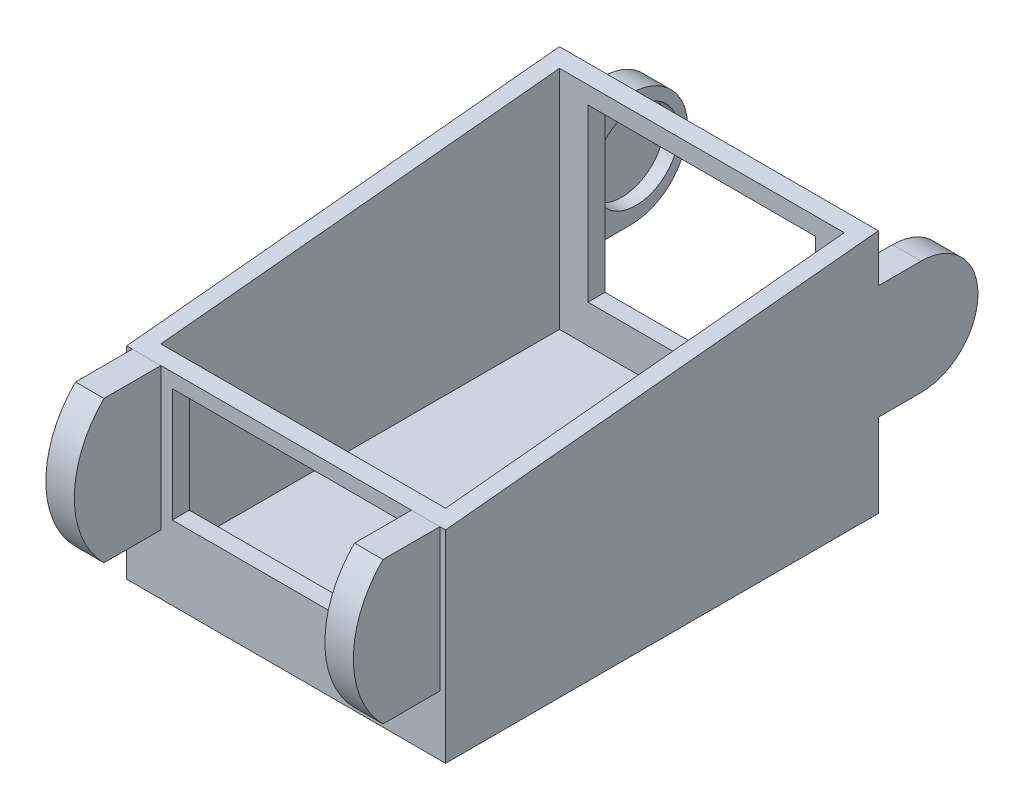
ISO-10303-21;
HEADER;
FILE_DESCRIPTION(('STEP AP214'),'2;1');
FILE_NAME('part.step','',(''),(''),'','','');
FILE_SCHEMA(('AUTOMOTIVE_DESIGN { 1 0 10303 214 1 1 1 1 }'));
ENDSEC;
DATA;
#1=APPLICATION_CONTEXT('core data for automotive mechanical design processes');
#2=APPLICATION_PROTOCOL_DEFINITION('international standard','automotive_design',2000,#1);
#3=PRODUCT_CONTEXT('',#1,'mechanical');
#4=PRODUCT('Part','Part','',(#3));
#5=PRODUCT_RELATED_PRODUCT_CATEGORY('part','',(#4));
#6=PRODUCT_DEFINITION_FORMATION('','',#4);
#7=PRODUCT_DEFINITION_CONTEXT('part definition',#1,'design');
#8=PRODUCT_DEFINITION('design','',#6,#7);
#9=PRODUCT_DEFINITION_SHAPE('','',#8);
#10=(LENGTH_UNIT() NAMED_UNIT(*) SI_UNIT(.MILLI.,.METRE.));
#11=(NAMED_UNIT(*) PLANE_ANGLE_UNIT() SI_UNIT($,.RADIAN.));
#12=(NAMED_UNIT(*) SI_UNIT($,.STERADIAN.) SOLID_ANGLE_UNIT());
#13=UNCERTAINTY_MEASURE_WITH_UNIT(LENGTH_MEASURE(1.E-05),#10,'distance_accuracy_value','');
#14=(GEOMETRIC_REPRESENTATION_CONTEXT(3) GLOBAL_UNCERTAINTY_ASSIGNED_CONTEXT((#13)) GLOBAL_UNIT_ASSIGNED_CONTEXT((#10,
#11,#12)) REPRESENTATION_CONTEXT('',''));
#15=CARTESIAN_POINT('',(0.,0.,0.));
#16=DIRECTION('',(0.,0.,1.));
#17=DIRECTION('',(1.,0.,0.));
#18=AXIS2_PLACEMENT_3D('',#15,#16,#17);
#19=CARTESIAN_POINT('',(25.,40.,-38.));
#20=DIRECTION('',(0.,0.,1.));
#21=DIRECTION('',(1.,0.,0.));
#22=AXIS2_PLACEMENT_3D('',#19,#20,#21);
#23=PLANE('',#22);
#24=DIRECTION('',(1.,0.,0.));
#25=VECTOR('',#24,1.);
#26=CARTESIAN_POINT('',(-20.,36.6359931359933,-38.));
#27=LINE('',#26,#25);
#28=CARTESIAN_POINT('',(-20.,36.6359931359933,-38.));
#29=VERTEX_POINT('',#28);
#30=CARTESIAN_POINT('',(20.,36.6359931359933,-38.));
#31=VERTEX_POINT('',#30);
#32=EDGE_CURVE('E319',#29,#31,#27,.T.);
#33=ORIENTED_EDGE('',*,*,#32,.F.);
#34=DIRECTION('',(0.,1.,0.));
#35=VECTOR('',#34,1.);
#36=CARTESIAN_POINT('',(-20.,6.63599313599334,-38.));
#37=LINE('',#36,#35);
#38=CARTESIAN_POINT('',(-20.,6.63599313599334,-38.));
#39=VERTEX_POINT('',#38);
#40=EDGE_CURVE('E302',#39,#29,#37,.T.);
#41=ORIENTED_EDGE('',*,*,#40,.F.);
#42=DIRECTION('',(1.,0.,0.));
#43=VECTOR('',#42,1.);
#44=CARTESIAN_POINT('',(-20.,6.63599313599334,-38.));
#45=LINE('',#44,#43);
#46=CARTESIAN_POINT('',(20.,6.63599313599334,-38.));
#47=VERTEX_POINT('',#46);
#48=EDGE_CURVE('E325',#39,#47,#45,.T.);
#49=ORIENTED_EDGE('',*,*,#48,.T.);
#50=DIRECTION('',(0.,1.,0.));
#51=VECTOR('',#50,1.);
#52=CARTESIAN_POINT('',(20.,6.63599313599334,-38.));
#53=LINE('',#52,#51);
#54=EDGE_CURVE('E322',#47,#31,#53,.T.);
#55=ORIENTED_EDGE('',*,*,#54,.T.);
#56=EDGE_LOOP('',(#33,#41,#49,#55));
#57=FACE_BOUND('',#56,.T.);
#58=DIRECTION('',(1.,0.,0.));
#59=VECTOR('',#58,1.);
#60=CARTESIAN_POINT('',(23.,11.6359931359933,-38.));
#61=LINE('',#60,#59);
#62=CARTESIAN_POINT('',(23.,11.6359931359933,-38.));
#63=VERTEX_POINT('',#62);
#64=CARTESIAN_POINT('',(28.,11.6359931359933,-38.));
#65=VERTEX_POINT('',#64);
#66=EDGE_CURVE('E372',#63,#65,#61,.T.);
#67=ORIENTED_EDGE('',*,*,#66,.T.);
#68=DIRECTION('',(0.,-1.,0.));
#69=VECTOR('',#68,1.);
#70=CARTESIAN_POINT('',(28.,40.,-38.));
#71=LINE('',#70,#69);
#72=CARTESIAN_POINT('',(28.,-3.,-38.));
#73=VERTEX_POINT('',#72);
#74=EDGE_CURVE('E523',#65,#73,#71,.T.);
#75=ORIENTED_EDGE('',*,*,#74,.T.);
#76=DIRECTION('',(-1.,0.,0.));
#77=VECTOR('',#76,1.);
#78=CARTESIAN_POINT('',(25.,-3.,-38.));
#79=LINE('',#78,#77);
#80=CARTESIAN_POINT('',(-28.,-3.,-38.));
#81=VERTEX_POINT('',#80);
#82=EDGE_CURVE('E532',#73,#81,#79,.T.);
#83=ORIENTED_EDGE('',*,*,#82,.T.);
#84=DIRECTION('',(0.,-1.,0.));
#85=VECTOR('',#84,1.);
#86=CARTESIAN_POINT('',(-28.,40.,-38.));
#87=LINE('',#86,#85);
#88=CARTESIAN_POINT('',(-28.,11.6359931359933,-38.));
#89=VERTEX_POINT('',#88);
#90=EDGE_CURVE('E524',#89,#81,#87,.T.);
#91=ORIENTED_EDGE('',*,*,#90,.F.);
#92=DIRECTION('',(-1.,0.,0.));
#93=VECTOR('',#92,1.);
#94=CARTESIAN_POINT('',(-23.,11.6359931359933,-38.));
#95=LINE('',#94,#93);
#96=CARTESIAN_POINT('',(-23.,11.6359931359933,-38.));
#97=VERTEX_POINT('',#96);
#98=EDGE_CURVE('E406',#97,#89,#95,.T.);
#99=ORIENTED_EDGE('',*,*,#98,.F.);
#100=DIRECTION('',(0.,-1.,0.));
#101=VECTOR('',#100,1.);
#102=CARTESIAN_POINT('',(-23.,31.6359931359933,-38.));
#103=LINE('',#102,#101);
#104=CARTESIAN_POINT('',(-23.,31.6359931359933,-38.));
#105=VERTEX_POINT('',#104);
#106=EDGE_CURVE('E387',#105,#97,#103,.T.);
#107=ORIENTED_EDGE('',*,*,#106,.F.);
#108=DIRECTION('',(-1.,0.,0.));
#109=VECTOR('',#108,1.);
#110=CARTESIAN_POINT('',(-23.,31.6359931359933,-38.));
#111=LINE('',#110,#109);
#112=CARTESIAN_POINT('',(-28.,31.6359931359933,-38.));
#113=VERTEX_POINT('',#112);
#114=EDGE_CURVE('E403',#105,#113,#111,.T.);
#115=ORIENTED_EDGE('',*,*,#114,.T.);
#116=CARTESIAN_POINT('',(-28.,40.,-38.));
#117=VERTEX_POINT('',#116);
#118=EDGE_CURVE('E520',#117,#113,#87,.T.);
#119=ORIENTED_EDGE('',*,*,#118,.F.);
#120=DIRECTION('',(-1.,0.,0.));
#121=VECTOR('',#120,1.);
#122=CARTESIAN_POINT('',(25.,40.,-38.));
#123=LINE('',#122,#121);
#124=CARTESIAN_POINT('',(28.,40.,-38.));
#125=VERTEX_POINT('',#124);
#126=EDGE_CURVE('E536',#125,#117,#123,.T.);
#127=ORIENTED_EDGE('',*,*,#126,.F.);
#128=CARTESIAN_POINT('',(28.,31.6359931359933,-38.));
#129=VERTEX_POINT('',#128);
#130=EDGE_CURVE('E529',#125,#129,#71,.T.);
#131=ORIENTED_EDGE('',*,*,#130,.T.);
#132=DIRECTION('',(1.,0.,0.));
#133=VECTOR('',#132,1.);
#134=CARTESIAN_POINT('',(23.,31.6359931359933,-38.));
#135=LINE('',#134,#133);
#136=CARTESIAN_POINT('',(23.,31.6359931359933,-38.));
#137=VERTEX_POINT('',#136);
#138=EDGE_CURVE('E375',#137,#129,#135,.T.);
#139=ORIENTED_EDGE('',*,*,#138,.F.);
#140=DIRECTION('',(0.,-1.,0.));
#141=VECTOR('',#140,1.);
#142=CARTESIAN_POINT('',(23.,31.6359931359933,-38.));
#143=LINE('',#142,#141);
#144=EDGE_CURVE('E356',#137,#63,#143,.T.);
#145=ORIENTED_EDGE('',*,*,#144,.T.);
#146=EDGE_LOOP('',(#67,#75,#83,#91,#99,#107,#115,#119,#127,#131,#139,#145));
#147=FACE_BOUND('',#146,.T.);
#148=ADVANCED_FACE('F72',(#57,#147),#23,.F.);
#149=CARTESIAN_POINT('',(-28.,40.,35.));
#150=DIRECTION('',(1.,0.,0.));
#151=DIRECTION('',(0.,0.,-1.));
#152=AXIS2_PLACEMENT_3D('',#149,#150,#151);
#153=PLANE('',#152);
#154=DIRECTION('',(0.,0.0982071702668681,-0.995165992037597));
#155=VECTOR('',#154,1.);
#156=CARTESIAN_POINT('',(-28.,32.5,38.));
#157=LINE('',#156,#155);
#158=CARTESIAN_POINT('',(-28.,32.5,38.));
#159=VERTEX_POINT('',#158);
#160=EDGE_CURVE('E402',#159,#117,#157,.T.);
#161=ORIENTED_EDGE('',*,*,#160,.T.);
#162=ORIENTED_EDGE('',*,*,#118,.T.);
#163=DIRECTION('',(0.,0.,-1.));
#164=VECTOR('',#163,1.);
#165=CARTESIAN_POINT('',(-28.,31.6359931359933,-38.));
#166=LINE('',#165,#164);
#167=CARTESIAN_POINT('',(-28.,31.6359931359933,-45.5));
#168=VERTEX_POINT('',#167);
#169=EDGE_CURVE('E384',#113,#168,#166,.T.);
#170=ORIENTED_EDGE('',*,*,#169,.T.);
#171=CARTESIAN_POINT('',(-28.,21.6359931359933,-45.5));
#172=DIRECTION('',(-1.,0.,0.));
#173=DIRECTION('',(0.,0.,1.));
#174=AXIS2_PLACEMENT_3D('',#171,#172,#173);
#175=CIRCLE('',#174,10.);
#176=CARTESIAN_POINT('',(-28.,11.6359931359933,-45.5));
#177=VERTEX_POINT('',#176);
#178=EDGE_CURVE('E371',#168,#177,#175,.T.);
#179=ORIENTED_EDGE('',*,*,#178,.T.);
#180=DIRECTION('',(0.,0.,1.));
#181=VECTOR('',#180,1.);
#182=CARTESIAN_POINT('',(-28.,11.6359931359933,-45.5));
#183=LINE('',#182,#181);
#184=EDGE_CURVE('E395',#177,#89,#183,.T.);
#185=ORIENTED_EDGE('',*,*,#184,.T.);
#186=ORIENTED_EDGE('',*,*,#90,.T.);
#187=DIRECTION('',(0.,0.,1.));
#188=VECTOR('',#187,1.);
#189=CARTESIAN_POINT('',(-28.,-3.,35.));
#190=LINE('',#189,#188);
#191=CARTESIAN_POINT('',(-28.,-3.,38.));
#192=VERTEX_POINT('',#191);
#193=EDGE_CURVE('E512',#81,#192,#190,.T.);
#194=ORIENTED_EDGE('',*,*,#193,.T.);
#195=DIRECTION('',(0.,-1.,0.));
#196=VECTOR('',#195,1.);
#197=CARTESIAN_POINT('',(-28.,40.,38.));
#198=LINE('',#197,#196);
#199=EDGE_CURVE('E516',#159,#192,#198,.T.);
#200=ORIENTED_EDGE('',*,*,#199,.F.);
#201=EDGE_LOOP('',(#161,#162,#170,#179,#185,#186,#194,#200));
#202=FACE_BOUND('',#201,.T.);
#203=ADVANCED_FACE('F570',(#202),#153,.F.);
#204=CARTESIAN_POINT('',(25.,40.,38.));
#205=DIRECTION('',(0.,0.,-1.));
#206=DIRECTION('',(-1.,0.,0.));
#207=AXIS2_PLACEMENT_3D('',#204,#205,#206);
#208=PLANE('',#207);
#209=DIRECTION('',(0.,-1.,0.));
#210=VECTOR('',#209,1.);
#211=CARTESIAN_POINT('',(20.,10.,38.));
#212=LINE('',#211,#210);
#213=CARTESIAN_POINT('',(20.,30.,38.));
#214=VERTEX_POINT('',#213);
#215=CARTESIAN_POINT('',(20.,10.,38.));
#216=VERTEX_POINT('',#215);
#217=EDGE_CURVE('E280',#214,#216,#212,.T.);
#218=ORIENTED_EDGE('',*,*,#217,.T.);
#219=DIRECTION('',(-1.,0.,0.));
#220=VECTOR('',#219,1.);
#221=CARTESIAN_POINT('',(20.,10.,38.));
#222=LINE('',#221,#220);
#223=CARTESIAN_POINT('',(-20.,10.,38.));
#224=VERTEX_POINT('',#223);
#225=EDGE_CURVE('E315',#216,#224,#222,.T.);
#226=ORIENTED_EDGE('',*,*,#225,.T.);
#227=DIRECTION('',(0.,1.,0.));
#228=VECTOR('',#227,1.);
#229=CARTESIAN_POINT('',(-20.,10.,38.));
#230=LINE('',#229,#228);
#231=CARTESIAN_POINT('',(-20.,30.,38.));
#232=VERTEX_POINT('',#231);
#233=EDGE_CURVE('E300',#224,#232,#230,.T.);
#234=ORIENTED_EDGE('',*,*,#233,.T.);
#235=DIRECTION('',(1.,0.,0.));
#236=VECTOR('',#235,1.);
#237=CARTESIAN_POINT('',(20.,30.,38.));
#238=LINE('',#237,#236);
#239=EDGE_CURVE('E293',#232,#214,#238,.T.);
#240=ORIENTED_EDGE('',*,*,#239,.T.);
#241=EDGE_LOOP('',(#218,#226,#234,#240));
#242=FACE_BOUND('',#241,.T.);
#243=DIRECTION('',(-1.,0.,0.));
#244=VECTOR('',#243,1.);
#245=CARTESIAN_POINT('',(28.,32.5,38.));
#246=LINE('',#245,#244);
#247=CARTESIAN_POINT('',(-27.,32.5,38.));
#248=VERTEX_POINT('',#247);
#249=EDGE_CURVE('E411',#248,#159,#246,.T.);
#250=ORIENTED_EDGE('',*,*,#249,.T.);
#251=ORIENTED_EDGE('',*,*,#199,.T.);
#252=DIRECTION('',(1.,0.,0.));
#253=VECTOR('',#252,1.);
#254=CARTESIAN_POINT('',(25.,-3.,38.));
#255=LINE('',#254,#253);
#256=CARTESIAN_POINT('',(28.,-3.,38.));
#257=VERTEX_POINT('',#256);
#258=EDGE_CURVE('E515',#192,#257,#255,.T.);
#259=ORIENTED_EDGE('',*,*,#258,.T.);
#260=DIRECTION('',(0.,-1.,0.));
#261=VECTOR('',#260,1.);
#262=CARTESIAN_POINT('',(28.,40.,38.));
#263=LINE('',#262,#261);
#264=CARTESIAN_POINT('',(28.,32.5,38.));
#265=VERTEX_POINT('',#264);
#266=EDGE_CURVE('E519',#265,#257,#263,.T.);
#267=ORIENTED_EDGE('',*,*,#266,.F.);
#268=CARTESIAN_POINT('',(27.,32.5,38.));
#269=VERTEX_POINT('',#268);
#270=EDGE_CURVE('E414',#265,#269,#246,.T.);
#271=ORIENTED_EDGE('',*,*,#270,.T.);
#272=DIRECTION('',(0.,-1.,0.));
#273=VECTOR('',#272,1.);
#274=CARTESIAN_POINT('',(27.,32.5,38.));
#275=LINE('',#274,#273);
#276=CARTESIAN_POINT('',(27.,7.49999999999999,38.));
#277=VERTEX_POINT('',#276);
#278=EDGE_CURVE('E472',#269,#277,#275,.T.);
#279=ORIENTED_EDGE('',*,*,#278,.T.);
#280=DIRECTION('',(-1.,0.,0.));
#281=VECTOR('',#280,1.);
#282=CARTESIAN_POINT('',(27.,7.5,38.));
#283=LINE('',#282,#281);
#284=CARTESIAN_POINT('',(22.,7.5,38.));
#285=VERTEX_POINT('',#284);
#286=EDGE_CURVE('E483',#277,#285,#283,.T.);
#287=ORIENTED_EDGE('',*,*,#286,.T.);
#288=DIRECTION('',(0.,-1.,0.));
#289=VECTOR('',#288,1.);
#290=CARTESIAN_POINT('',(22.,32.5,38.));
#291=LINE('',#290,#289);
#292=CARTESIAN_POINT('',(22.,32.5,38.));
#293=VERTEX_POINT('',#292);
#294=EDGE_CURVE('E455',#293,#285,#291,.T.);
#295=ORIENTED_EDGE('',*,*,#294,.F.);
#296=CARTESIAN_POINT('',(-22.,32.5,38.));
#297=VERTEX_POINT('',#296);
#298=EDGE_CURVE('E418',#293,#297,#246,.T.);
#299=ORIENTED_EDGE('',*,*,#298,.T.);
#300=DIRECTION('',(0.,-1.,0.));
#301=VECTOR('',#300,1.);
#302=CARTESIAN_POINT('',(-22.,32.5,38.));
#303=LINE('',#302,#301);
#304=CARTESIAN_POINT('',(-22.,7.5,38.));
#305=VERTEX_POINT('',#304);
#306=EDGE_CURVE('E430',#297,#305,#303,.T.);
#307=ORIENTED_EDGE('',*,*,#306,.T.);
#308=DIRECTION('',(1.,0.,0.));
#309=VECTOR('',#308,1.);
#310=CARTESIAN_POINT('',(-27.,7.5,38.));
#311=LINE('',#310,#309);
#312=CARTESIAN_POINT('',(-27.,7.49999999999999,38.));
#313=VERTEX_POINT('',#312);
#314=EDGE_CURVE('E452',#313,#305,#311,.T.);
#315=ORIENTED_EDGE('',*,*,#314,.F.);
#316=DIRECTION('',(0.,-1.,0.));
#317=VECTOR('',#316,1.);
#318=CARTESIAN_POINT('',(-27.,32.5,38.));
#319=LINE('',#318,#317);
#320=EDGE_CURVE('E441',#248,#313,#319,.T.);
#321=ORIENTED_EDGE('',*,*,#320,.F.);
#322=EDGE_LOOP('',(#250,#251,#259,#267,#271,#279,#287,#295,#299,#307,#315,#321));
#323=FACE_BOUND('',#322,.T.);
#324=ADVANCED_FACE('F298',(#242,#323),#208,.F.);
#325=CARTESIAN_POINT('',(28.,40.,35.));
#326=DIRECTION('',(-1.,0.,0.));
#327=DIRECTION('',(0.,0.,1.));
#328=AXIS2_PLACEMENT_3D('',#325,#326,#327);
#329=PLANE('',#328);
#330=DIRECTION('',(0.,0.0982071702668681,-0.995165992037597));
#331=VECTOR('',#330,1.);
#332=CARTESIAN_POINT('',(28.,32.5,38.));
#333=LINE('',#332,#331);
#334=EDGE_CURVE('E409',#265,#125,#333,.T.);
#335=ORIENTED_EDGE('',*,*,#334,.F.);
#336=ORIENTED_EDGE('',*,*,#266,.T.);
#337=DIRECTION('',(0.,0.,-1.));
#338=VECTOR('',#337,1.);
#339=CARTESIAN_POINT('',(28.,-3.,35.));
#340=LINE('',#339,#338);
#341=EDGE_CURVE('E527',#257,#73,#340,.T.);
#342=ORIENTED_EDGE('',*,*,#341,.T.);
#343=ORIENTED_EDGE('',*,*,#74,.F.);
#344=DIRECTION('',(0.,0.,1.));
#345=VECTOR('',#344,1.);
#346=CARTESIAN_POINT('',(28.,11.6359931359933,-45.5));
#347=LINE('',#346,#345);
#348=CARTESIAN_POINT('',(28.,11.6359931359933,-45.5));
#349=VERTEX_POINT('',#348);
#350=EDGE_CURVE('E354',#349,#65,#347,.T.);
#351=ORIENTED_EDGE('',*,*,#350,.F.);
#352=CARTESIAN_POINT('',(28.,21.6359931359933,-45.5));
#353=DIRECTION('',(-1.,0.,0.));
#354=DIRECTION('',(0.,0.,1.));
#355=AXIS2_PLACEMENT_3D('',#352,#353,#354);
#356=CIRCLE('',#355,10.);
#357=CARTESIAN_POINT('',(28.,31.6359931359933,-45.5));
#358=VERTEX_POINT('',#357);
#359=EDGE_CURVE('E347',#358,#349,#356,.T.);
#360=ORIENTED_EDGE('',*,*,#359,.F.);
#361=DIRECTION('',(0.,0.,-1.));
#362=VECTOR('',#361,1.);
#363=CARTESIAN_POINT('',(28.,31.6359931359933,-38.));
#364=LINE('',#363,#362);
#365=EDGE_CURVE('E364',#129,#358,#364,.T.);
#366=ORIENTED_EDGE('',*,*,#365,.F.);
#367=ORIENTED_EDGE('',*,*,#130,.F.);
#368=EDGE_LOOP('',(#335,#336,#342,#343,#351,#360,#366,#367));
#369=FACE_BOUND('',#368,.T.);
#370=ADVANCED_FACE('F582',(#369),#329,.F.);
#371=CARTESIAN_POINT('',(0.,-3.,0.));
#372=DIRECTION('',(0.,1.,0.));
#373=DIRECTION('',(0.,0.,1.));
#374=AXIS2_PLACEMENT_3D('',#371,#372,#373);
#375=PLANE('',#374);
#376=ORIENTED_EDGE('',*,*,#193,.F.);
#377=ORIENTED_EDGE('',*,*,#82,.F.);
#378=ORIENTED_EDGE('',*,*,#341,.F.);
#379=ORIENTED_EDGE('',*,*,#258,.F.);
#380=EDGE_LOOP('',(#376,#377,#378,#379));
#381=FACE_BOUND('',#380,.T.);
#382=ADVANCED_FACE('F74',(#381),#375,.F.);
#383=CARTESIAN_POINT('',(27.,32.5,38.));
#384=DIRECTION('',(0.,1.,0.));
#385=DIRECTION('',(0.,0.,1.));
#386=AXIS2_PLACEMENT_3D('',#383,#384,#385);
#387=PLANE('',#386);
#388=DIRECTION('',(-1.,0.,0.));
#389=VECTOR('',#388,1.);
#390=CARTESIAN_POINT('',(27.,32.5,38.));
#391=LINE('',#390,#389);
#392=EDGE_CURVE('E484',#269,#293,#391,.T.);
#393=ORIENTED_EDGE('',*,*,#392,.T.);
#394=DIRECTION('',(0.,0.,-1.));
#395=VECTOR('',#394,1.);
#396=CARTESIAN_POINT('',(22.,32.5,38.));
#397=LINE('',#396,#395);
#398=CARTESIAN_POINT('',(22.,32.5,48.));
#399=VERTEX_POINT('',#398);
#400=EDGE_CURVE('E469',#399,#293,#397,.T.);
#401=ORIENTED_EDGE('',*,*,#400,.F.);
#402=DIRECTION('',(-1.,0.,0.));
#403=VECTOR('',#402,1.);
#404=CARTESIAN_POINT('',(27.,32.5,48.));
#405=LINE('',#404,#403);
#406=CARTESIAN_POINT('',(27.,32.5,48.));
#407=VERTEX_POINT('',#406);
#408=EDGE_CURVE('E488',#407,#399,#405,.T.);
#409=ORIENTED_EDGE('',*,*,#408,.F.);
#410=DIRECTION('',(0.,0.,-1.));
#411=VECTOR('',#410,1.);
#412=CARTESIAN_POINT('',(27.,32.5,38.));
#413=LINE('',#412,#411);
#414=EDGE_CURVE('E480',#407,#269,#413,.T.);
#415=ORIENTED_EDGE('',*,*,#414,.T.);
#416=EDGE_LOOP('',(#393,#401,#409,#415));
#417=FACE_BOUND('',#416,.T.);
#418=ADVANCED_FACE('F615',(#417),#387,.T.);
#419=CARTESIAN_POINT('',(27.,20.,35.5759615384616));
#420=DIRECTION('',(-1.,0.,0.));
#421=DIRECTION('',(0.,0.,1.));
#422=AXIS2_PLACEMENT_3D('',#419,#420,#421);
#423=CYLINDRICAL_SURFACE('',#422,17.6240384615385);
#424=ORIENTED_EDGE('',*,*,#408,.T.);
#425=CARTESIAN_POINT('',(22.,20.,35.5759615384616));
#426=DIRECTION('',(-1.,0.,0.));
#427=DIRECTION('',(0.,0.,-1.));
#428=AXIS2_PLACEMENT_3D('',#425,#426,#427);
#429=CIRCLE('',#428,17.6240384615385);
#430=CARTESIAN_POINT('',(22.,7.50000000000001,48.));
#431=VERTEX_POINT('',#430);
#432=EDGE_CURVE('E466',#431,#399,#429,.T.);
#433=ORIENTED_EDGE('',*,*,#432,.F.);
#434=DIRECTION('',(-1.,0.,0.));
#435=VECTOR('',#434,1.);
#436=CARTESIAN_POINT('',(27.,7.50000000000001,48.));
#437=LINE('',#436,#435);
#438=CARTESIAN_POINT('',(27.,7.50000000000001,48.));
#439=VERTEX_POINT('',#438);
#440=EDGE_CURVE('E490',#439,#431,#437,.T.);
#441=ORIENTED_EDGE('',*,*,#440,.F.);
#442=CARTESIAN_POINT('',(27.,20.,35.5759615384616));
#443=DIRECTION('',(-1.,0.,0.));
#444=DIRECTION('',(0.,0.,-1.));
#445=AXIS2_PLACEMENT_3D('',#442,#443,#444);
#446=CIRCLE('',#445,17.6240384615385);
#447=EDGE_CURVE('E477',#439,#407,#446,.T.);
#448=ORIENTED_EDGE('',*,*,#447,.T.);
#449=EDGE_LOOP('',(#424,#433,#441,#448));
#450=FACE_BOUND('',#449,.T.);
#451=ADVANCED_FACE('F611',(#450),#423,.T.);
#452=CARTESIAN_POINT('',(27.,7.5,48.));
#453=DIRECTION('',(0.,-1.,0.));
#454=DIRECTION('',(0.,0.,-1.));
#455=AXIS2_PLACEMENT_3D('',#452,#453,#454);
#456=PLANE('',#455);
#457=ORIENTED_EDGE('',*,*,#440,.T.);
#458=DIRECTION('',(0.,0.,1.));
#459=VECTOR('',#458,1.);
#460=CARTESIAN_POINT('',(22.,7.5,48.));
#461=LINE('',#460,#459);
#462=EDGE_CURVE('E463',#285,#431,#461,.T.);
#463=ORIENTED_EDGE('',*,*,#462,.F.);
#464=ORIENTED_EDGE('',*,*,#286,.F.);
#465=DIRECTION('',(0.,0.,1.));
#466=VECTOR('',#465,1.);
#467=CARTESIAN_POINT('',(27.,7.5,48.));
#468=LINE('',#467,#466);
#469=EDGE_CURVE('E474',#277,#439,#468,.T.);
#470=ORIENTED_EDGE('',*,*,#469,.T.);
#471=EDGE_LOOP('',(#457,#463,#464,#470));
#472=FACE_BOUND('',#471,.T.);
#473=ADVANCED_FACE('F607',(#472),#456,.T.);
#474=CARTESIAN_POINT('',(27.,20.,35.5759615384616));
#475=DIRECTION('',(1.,0.,0.));
#476=DIRECTION('',(0.,0.,-1.));
#477=AXIS2_PLACEMENT_3D('',#474,#475,#476);
#478=PLANE('',#477);
#479=ORIENTED_EDGE('',*,*,#278,.F.);
#480=ORIENTED_EDGE('',*,*,#414,.F.);
#481=ORIENTED_EDGE('',*,*,#447,.F.);
#482=ORIENTED_EDGE('',*,*,#469,.F.);
#483=EDGE_LOOP('',(#479,#480,#481,#482));
#484=FACE_BOUND('',#483,.T.);
#485=ADVANCED_FACE('F610',(#484),#478,.T.);
#486=CARTESIAN_POINT('',(22.,20.,35.5759615384616));
#487=DIRECTION('',(1.,0.,0.));
#488=DIRECTION('',(0.,0.,-1.));
#489=AXIS2_PLACEMENT_3D('',#486,#487,#488);
#490=PLANE('',#489);
#491=ORIENTED_EDGE('',*,*,#294,.T.);
#492=ORIENTED_EDGE('',*,*,#462,.T.);
#493=ORIENTED_EDGE('',*,*,#432,.T.);
#494=ORIENTED_EDGE('',*,*,#400,.T.);
#495=EDGE_LOOP('',(#491,#492,#493,#494));
#496=FACE_BOUND('',#495,.T.);
#497=ADVANCED_FACE('F622',(#496),#490,.F.);
#498=CARTESIAN_POINT('',(-27.,7.5,48.));
#499=DIRECTION('',(0.,1.,0.));
#500=DIRECTION('',(0.,0.,1.));
#501=AXIS2_PLACEMENT_3D('',#498,#499,#500);
#502=PLANE('',#501);
#503=ORIENTED_EDGE('',*,*,#314,.T.);
#504=DIRECTION('',(0.,0.,1.));
#505=VECTOR('',#504,1.);
#506=CARTESIAN_POINT('',(-22.,7.5,48.));
#507=LINE('',#506,#505);
#508=CARTESIAN_POINT('',(-22.,7.50000000000001,48.));
#509=VERTEX_POINT('',#508);
#510=EDGE_CURVE('E438',#305,#509,#507,.T.);
#511=ORIENTED_EDGE('',*,*,#510,.T.);
#512=DIRECTION('',(1.,0.,0.));
#513=VECTOR('',#512,1.);
#514=CARTESIAN_POINT('',(-27.,7.50000000000001,48.));
#515=LINE('',#514,#513);
#516=CARTESIAN_POINT('',(-27.,7.50000000000001,48.));
#517=VERTEX_POINT('',#516);
#518=EDGE_CURVE('E456',#517,#509,#515,.T.);
#519=ORIENTED_EDGE('',*,*,#518,.F.);
#520=DIRECTION('',(0.,0.,1.));
#521=VECTOR('',#520,1.);
#522=CARTESIAN_POINT('',(-27.,7.5,48.));
#523=LINE('',#522,#521);
#524=EDGE_CURVE('E449',#313,#517,#523,.T.);
#525=ORIENTED_EDGE('',*,*,#524,.F.);
#526=EDGE_LOOP('',(#503,#511,#519,#525));
#527=FACE_BOUND('',#526,.T.);
#528=ADVANCED_FACE('F626',(#527),#502,.F.);
#529=CARTESIAN_POINT('',(-27.,20.,35.5759615384616));
#530=DIRECTION('',(1.,0.,0.));
#531=DIRECTION('',(0.,0.,-1.));
#532=AXIS2_PLACEMENT_3D('',#529,#530,#531);
#533=CYLINDRICAL_SURFACE('',#532,17.6240384615385);
#534=ORIENTED_EDGE('',*,*,#518,.T.);
#535=CARTESIAN_POINT('',(-22.,20.,35.5759615384616));
#536=DIRECTION('',(-1.,0.,0.));
#537=DIRECTION('',(0.,0.,-1.));
#538=AXIS2_PLACEMENT_3D('',#535,#536,#537);
#539=CIRCLE('',#538,17.6240384615385);
#540=CARTESIAN_POINT('',(-22.,32.5,48.));
#541=VERTEX_POINT('',#540);
#542=EDGE_CURVE('E435',#509,#541,#539,.T.);
#543=ORIENTED_EDGE('',*,*,#542,.T.);
#544=DIRECTION('',(1.,0.,0.));
#545=VECTOR('',#544,1.);
#546=CARTESIAN_POINT('',(-27.,32.5,48.));
#547=LINE('',#546,#545);
#548=CARTESIAN_POINT('',(-27.,32.5,48.));
#549=VERTEX_POINT('',#548);
#550=EDGE_CURVE('E458',#549,#541,#547,.T.);
#551=ORIENTED_EDGE('',*,*,#550,.F.);
#552=CARTESIAN_POINT('',(-27.,20.,35.5759615384616));
#553=DIRECTION('',(-1.,0.,0.));
#554=DIRECTION('',(0.,0.,-1.));
#555=AXIS2_PLACEMENT_3D('',#552,#553,#554);
#556=CIRCLE('',#555,17.6240384615385);
#557=EDGE_CURVE('E447',#517,#549,#556,.T.);
#558=ORIENTED_EDGE('',*,*,#557,.F.);
#559=EDGE_LOOP('',(#534,#543,#551,#558));
#560=FACE_BOUND('',#559,.T.);
#561=ADVANCED_FACE('F632',(#560),#533,.T.);
#562=CARTESIAN_POINT('',(-27.,32.5,38.));
#563=DIRECTION('',(0.,-1.,0.));
#564=DIRECTION('',(0.,0.,-1.));
#565=AXIS2_PLACEMENT_3D('',#562,#563,#564);
#566=PLANE('',#565);
#567=ORIENTED_EDGE('',*,*,#550,.T.);
#568=DIRECTION('',(0.,0.,-1.));
#569=VECTOR('',#568,1.);
#570=CARTESIAN_POINT('',(-22.,32.5,38.));
#571=LINE('',#570,#569);
#572=EDGE_CURVE('E432',#541,#297,#571,.T.);
#573=ORIENTED_EDGE('',*,*,#572,.T.);
#574=DIRECTION('',(1.,0.,0.));
#575=VECTOR('',#574,1.);
#576=CARTESIAN_POINT('',(-27.,32.5,38.));
#577=LINE('',#576,#575);
#578=EDGE_CURVE('E451',#248,#297,#577,.T.);
#579=ORIENTED_EDGE('',*,*,#578,.F.);
#580=DIRECTION('',(0.,0.,-1.));
#581=VECTOR('',#580,1.);
#582=CARTESIAN_POINT('',(-27.,32.5,38.));
#583=LINE('',#582,#581);
#584=EDGE_CURVE('E444',#549,#248,#583,.T.);
#585=ORIENTED_EDGE('',*,*,#584,.F.);
#586=EDGE_LOOP('',(#567,#573,#579,#585));
#587=FACE_BOUND('',#586,.T.);
#588=ADVANCED_FACE('F628',(#587),#566,.F.);
#589=CARTESIAN_POINT('',(-27.,20.,35.5759615384616));
#590=DIRECTION('',(-1.,0.,0.));
#591=DIRECTION('',(0.,0.,-1.));
#592=AXIS2_PLACEMENT_3D('',#589,#590,#591);
#593=PLANE('',#592);
#594=ORIENTED_EDGE('',*,*,#320,.T.);
#595=ORIENTED_EDGE('',*,*,#524,.T.);
#596=ORIENTED_EDGE('',*,*,#557,.T.);
#597=ORIENTED_EDGE('',*,*,#584,.T.);
#598=EDGE_LOOP('',(#594,#595,#596,#597));
#599=FACE_BOUND('',#598,.T.);
#600=ADVANCED_FACE('F631',(#599),#593,.T.);
#601=CARTESIAN_POINT('',(-22.,20.,35.5759615384616));
#602=DIRECTION('',(-1.,0.,0.));
#603=DIRECTION('',(0.,0.,-1.));
#604=AXIS2_PLACEMENT_3D('',#601,#602,#603);
#605=PLANE('',#604);
#606=ORIENTED_EDGE('',*,*,#306,.F.);
#607=ORIENTED_EDGE('',*,*,#572,.F.);
#608=ORIENTED_EDGE('',*,*,#542,.F.);
#609=ORIENTED_EDGE('',*,*,#510,.F.);
#610=EDGE_LOOP('',(#606,#607,#608,#609));
#611=FACE_BOUND('',#610,.T.);
#612=ADVANCED_FACE('F642',(#611),#605,.F.);
#613=CARTESIAN_POINT('',(28.,32.5,38.));
#614=DIRECTION('',(0.,0.995165992037597,0.0982071702668681));
#615=DIRECTION('',(0.,-0.0982071702668681,0.995165992037597));
#616=AXIS2_PLACEMENT_3D('',#613,#614,#615);
#617=PLANE('',#616);
#618=DIRECTION('',(-1.,0.,0.));
#619=VECTOR('',#618,1.);
#620=CARTESIAN_POINT('',(25.,39.7039473684211,-35.));
#621=LINE('',#620,#619);
#622=CARTESIAN_POINT('',(25.,39.7039473684211,-35.));
#623=VERTEX_POINT('',#622);
#624=CARTESIAN_POINT('',(-25.,39.7039473684211,-35.));
#625=VERTEX_POINT('',#624);
#626=EDGE_CURVE('E417',#623,#625,#621,.T.);
#627=ORIENTED_EDGE('',*,*,#626,.F.);
#628=DIRECTION('',(0.,0.0982071702668681,-0.995165992037597));
#629=VECTOR('',#628,1.);
#630=CARTESIAN_POINT('',(25.,32.8655321702602,34.2959406746967));
#631=LINE('',#630,#629);
#632=CARTESIAN_POINT('',(25.,32.7960526315789,35.));
#633=VERTEX_POINT('',#632);
#634=EDGE_CURVE('E421',#633,#623,#631,.T.);
#635=ORIENTED_EDGE('',*,*,#634,.F.);
#636=DIRECTION('',(1.,0.,0.));
#637=VECTOR('',#636,1.);
#638=CARTESIAN_POINT('',(25.,32.7960526315789,35.));
#639=LINE('',#638,#637);
#640=CARTESIAN_POINT('',(-25.,32.7960526315789,35.));
#641=VERTEX_POINT('',#640);
#642=EDGE_CURVE('E424',#641,#633,#639,.T.);
#643=ORIENTED_EDGE('',*,*,#642,.F.);
#644=DIRECTION('',(0.,-0.0982071702668681,0.995165992037597));
#645=VECTOR('',#644,1.);
#646=CARTESIAN_POINT('',(-25.,32.8655321702602,34.2959406746967));
#647=LINE('',#646,#645);
#648=EDGE_CURVE('E427',#625,#641,#647,.T.);
#649=ORIENTED_EDGE('',*,*,#648,.F.);
#650=EDGE_LOOP('',(#627,#635,#643,#649));
#651=FACE_BOUND('',#650,.T.);
#652=ORIENTED_EDGE('',*,*,#160,.F.);
#653=ORIENTED_EDGE('',*,*,#249,.F.);
#654=ORIENTED_EDGE('',*,*,#578,.T.);
#655=ORIENTED_EDGE('',*,*,#298,.F.);
#656=ORIENTED_EDGE('',*,*,#392,.F.);
#657=ORIENTED_EDGE('',*,*,#270,.F.);
#658=ORIENTED_EDGE('',*,*,#334,.T.);
#659=ORIENTED_EDGE('',*,*,#126,.T.);
#660=EDGE_LOOP('',(#652,#653,#654,#655,#656,#657,#658,#659));
#661=FACE_BOUND('',#660,.T.);
#662=ADVANCED_FACE('F605',(#651,#661),#617,.T.);
#663=CARTESIAN_POINT('',(0.,0.,0.));
#664=DIRECTION('',(0.,1.,0.));
#665=DIRECTION('',(0.,0.,1.));
#666=AXIS2_PLACEMENT_3D('',#663,#664,#665);
#667=PLANE('',#666);
#668=DIRECTION('',(0.,0.,1.));
#669=VECTOR('',#668,1.);
#670=CARTESIAN_POINT('',(-25.,0.,35.));
#671=LINE('',#670,#669);
#672=CARTESIAN_POINT('',(-25.,0.,-35.));
#673=VERTEX_POINT('',#672);
#674=CARTESIAN_POINT('',(-25.,0.,35.));
#675=VERTEX_POINT('',#674);
#676=EDGE_CURVE('E487',#673,#675,#671,.T.);
#677=ORIENTED_EDGE('',*,*,#676,.T.);
#678=DIRECTION('',(1.,0.,0.));
#679=VECTOR('',#678,1.);
#680=CARTESIAN_POINT('',(25.,0.,35.));
#681=LINE('',#680,#679);
#682=CARTESIAN_POINT('',(25.,0.,35.));
#683=VERTEX_POINT('',#682);
#684=EDGE_CURVE('E495',#675,#683,#681,.T.);
#685=ORIENTED_EDGE('',*,*,#684,.T.);
#686=DIRECTION('',(0.,0.,-1.));
#687=VECTOR('',#686,1.);
#688=CARTESIAN_POINT('',(25.,0.,35.));
#689=LINE('',#688,#687);
#690=CARTESIAN_POINT('',(25.,0.,-35.));
#691=VERTEX_POINT('',#690);
#692=EDGE_CURVE('E498',#683,#691,#689,.T.);
#693=ORIENTED_EDGE('',*,*,#692,.T.);
#694=DIRECTION('',(-1.,0.,0.));
#695=VECTOR('',#694,1.);
#696=CARTESIAN_POINT('',(25.,0.,-35.));
#697=LINE('',#696,#695);
#698=EDGE_CURVE('E501',#691,#673,#697,.T.);
#699=ORIENTED_EDGE('',*,*,#698,.T.);
#700=EDGE_LOOP('',(#677,#685,#693,#699));
#701=FACE_BOUND('',#700,.T.);
#702=ADVANCED_FACE('F601',(#701),#667,.T.);
#703=CARTESIAN_POINT('',(25.,40.,-35.));
#704=DIRECTION('',(0.,0.,1.));
#705=DIRECTION('',(1.,0.,0.));
#706=AXIS2_PLACEMENT_3D('',#703,#704,#705);
#707=PLANE('',#706);
#708=DIRECTION('',(0.,-1.,0.));
#709=VECTOR('',#708,1.);
#710=CARTESIAN_POINT('',(-20.,40.,-35.));
#711=LINE('',#710,#709);
#712=CARTESIAN_POINT('',(-20.,36.6359931359933,-35.));
#713=VERTEX_POINT('',#712);
#714=CARTESIAN_POINT('',(-20.,6.63599313599334,-35.));
#715=VERTEX_POINT('',#714);
#716=EDGE_CURVE('E545',#713,#715,#711,.T.);
#717=ORIENTED_EDGE('',*,*,#716,.F.);
#718=DIRECTION('',(-1.,0.,0.));
#719=VECTOR('',#718,1.);
#720=CARTESIAN_POINT('',(25.,36.6359931359933,-35.));
#721=LINE('',#720,#719);
#722=CARTESIAN_POINT('',(20.,36.6359931359933,-35.));
#723=VERTEX_POINT('',#722);
#724=EDGE_CURVE('E518',#723,#713,#721,.T.);
#725=ORIENTED_EDGE('',*,*,#724,.F.);
#726=DIRECTION('',(0.,-1.,0.));
#727=VECTOR('',#726,1.);
#728=CARTESIAN_POINT('',(20.,40.,-35.));
#729=LINE('',#728,#727);
#730=CARTESIAN_POINT('',(20.,6.63599313599334,-35.));
#731=VERTEX_POINT('',#730);
#732=EDGE_CURVE('E539',#723,#731,#729,.T.);
#733=ORIENTED_EDGE('',*,*,#732,.T.);
#734=DIRECTION('',(-1.,0.,0.));
#735=VECTOR('',#734,1.);
#736=CARTESIAN_POINT('',(25.,6.63599313599333,-35.));
#737=LINE('',#736,#735);
#738=EDGE_CURVE('E542',#731,#715,#737,.T.);
#739=ORIENTED_EDGE('',*,*,#738,.T.);
#740=EDGE_LOOP('',(#717,#725,#733,#739));
#741=FACE_BOUND('',#740,.T.);
#742=DIRECTION('',(0.,-1.,0.));
#743=VECTOR('',#742,1.);
#744=CARTESIAN_POINT('',(25.,40.,-35.));
#745=LINE('',#744,#743);
#746=EDGE_CURVE('E506',#623,#691,#745,.T.);
#747=ORIENTED_EDGE('',*,*,#746,.F.);
#748=ORIENTED_EDGE('',*,*,#626,.T.);
#749=DIRECTION('',(0.,-1.,0.));
#750=VECTOR('',#749,1.);
#751=CARTESIAN_POINT('',(-25.,40.,-35.));
#752=LINE('',#751,#750);
#753=EDGE_CURVE('E504',#625,#673,#752,.T.);
#754=ORIENTED_EDGE('',*,*,#753,.T.);
#755=ORIENTED_EDGE('',*,*,#698,.F.);
#756=EDGE_LOOP('',(#747,#748,#754,#755));
#757=FACE_BOUND('',#756,.T.);
#758=ADVANCED_FACE('F598',(#741,#757),#707,.T.);
#759=CARTESIAN_POINT('',(25.,40.,35.));
#760=DIRECTION('',(-1.,0.,0.));
#761=DIRECTION('',(0.,0.,1.));
#762=AXIS2_PLACEMENT_3D('',#759,#760,#761);
#763=PLANE('',#762);
#764=DIRECTION('',(0.,-1.,0.));
#765=VECTOR('',#764,1.);
#766=CARTESIAN_POINT('',(25.,40.,35.));
#767=LINE('',#766,#765);
#768=EDGE_CURVE('E508',#633,#683,#767,.T.);
#769=ORIENTED_EDGE('',*,*,#768,.F.);
#770=ORIENTED_EDGE('',*,*,#634,.T.);
#771=ORIENTED_EDGE('',*,*,#746,.T.);
#772=ORIENTED_EDGE('',*,*,#692,.F.);
#773=EDGE_LOOP('',(#769,#770,#771,#772));
#774=FACE_BOUND('',#773,.T.);
#775=ADVANCED_FACE('F595',(#774),#763,.T.);
#776=CARTESIAN_POINT('',(25.,40.,35.));
#777=DIRECTION('',(0.,0.,-1.));
#778=DIRECTION('',(-1.,0.,0.));
#779=AXIS2_PLACEMENT_3D('',#776,#777,#778);
#780=PLANE('',#779);
#781=DIRECTION('',(-1.,0.,0.));
#782=VECTOR('',#781,1.);
#783=CARTESIAN_POINT('',(25.,10.,35.));
#784=LINE('',#783,#782);
#785=CARTESIAN_POINT('',(20.,10.,35.));
#786=VERTEX_POINT('',#785);
#787=CARTESIAN_POINT('',(-20.,10.,35.));
#788=VERTEX_POINT('',#787);
#789=EDGE_CURVE('E12',#786,#788,#784,.T.);
#790=ORIENTED_EDGE('',*,*,#789,.F.);
#791=DIRECTION('',(0.,-1.,0.));
#792=VECTOR('',#791,1.);
#793=CARTESIAN_POINT('',(20.,40.,35.));
#794=LINE('',#793,#792);
#795=CARTESIAN_POINT('',(20.,30.,35.));
#796=VERTEX_POINT('',#795);
#797=EDGE_CURVE('E80',#796,#786,#794,.T.);
#798=ORIENTED_EDGE('',*,*,#797,.F.);
#799=DIRECTION('',(1.,0.,0.));
#800=VECTOR('',#799,1.);
#801=CARTESIAN_POINT('',(25.,30.,35.));
#802=LINE('',#801,#800);
#803=CARTESIAN_POINT('',(-20.,30.,35.));
#804=VERTEX_POINT('',#803);
#805=EDGE_CURVE('E296',#804,#796,#802,.T.);
#806=ORIENTED_EDGE('',*,*,#805,.F.);
#807=DIRECTION('',(0.,1.,0.));
#808=VECTOR('',#807,1.);
#809=CARTESIAN_POINT('',(-20.,40.,35.));
#810=LINE('',#809,#808);
#811=EDGE_CURVE('E547',#788,#804,#810,.T.);
#812=ORIENTED_EDGE('',*,*,#811,.F.);
#813=EDGE_LOOP('',(#790,#798,#806,#812));
#814=FACE_BOUND('',#813,.T.);
#815=DIRECTION('',(0.,-1.,0.));
#816=VECTOR('',#815,1.);
#817=CARTESIAN_POINT('',(-25.,40.,35.));
#818=LINE('',#817,#816);
#819=EDGE_CURVE('E510',#641,#675,#818,.T.);
#820=ORIENTED_EDGE('',*,*,#819,.F.);
#821=ORIENTED_EDGE('',*,*,#642,.T.);
#822=ORIENTED_EDGE('',*,*,#768,.T.);
#823=ORIENTED_EDGE('',*,*,#684,.F.);
#824=EDGE_LOOP('',(#820,#821,#822,#823));
#825=FACE_BOUND('',#824,.T.);
#826=ADVANCED_FACE('F554',(#814,#825),#780,.T.);
#827=CARTESIAN_POINT('',(-25.,40.,35.));
#828=DIRECTION('',(1.,0.,0.));
#829=DIRECTION('',(0.,0.,-1.));
#830=AXIS2_PLACEMENT_3D('',#827,#828,#829);
#831=PLANE('',#830);
#832=ORIENTED_EDGE('',*,*,#753,.F.);
#833=ORIENTED_EDGE('',*,*,#648,.T.);
#834=ORIENTED_EDGE('',*,*,#819,.T.);
#835=ORIENTED_EDGE('',*,*,#676,.F.);
#836=EDGE_LOOP('',(#832,#833,#834,#835));
#837=FACE_BOUND('',#836,.T.);
#838=ADVANCED_FACE('F588',(#837),#831,.T.);
#839=CARTESIAN_POINT('',(-23.,21.6359931359933,-45.5));
#840=DIRECTION('',(-1.,0.,0.));
#841=DIRECTION('',(0.,0.,1.));
#842=AXIS2_PLACEMENT_3D('',#839,#840,#841);
#843=CYLINDRICAL_SURFACE('',#842,10.);
#844=ORIENTED_EDGE('',*,*,#178,.F.);
#845=DIRECTION('',(-1.,0.,0.));
#846=VECTOR('',#845,1.);
#847=CARTESIAN_POINT('',(-23.,31.6359931359933,-45.5));
#848=LINE('',#847,#846);
#849=CARTESIAN_POINT('',(-23.,31.6359931359933,-45.5));
#850=VERTEX_POINT('',#849);
#851=EDGE_CURVE('E400',#850,#168,#848,.T.);
#852=ORIENTED_EDGE('',*,*,#851,.F.);
#853=CARTESIAN_POINT('',(-23.,21.6359931359933,-45.5));
#854=DIRECTION('',(-1.,0.,0.));
#855=DIRECTION('',(0.,0.,1.));
#856=AXIS2_PLACEMENT_3D('',#853,#854,#855);
#857=CIRCLE('',#856,10.);
#858=CARTESIAN_POINT('',(-23.,11.6359931359933,-45.5));
#859=VERTEX_POINT('',#858);
#860=EDGE_CURVE('E380',#850,#859,#857,.T.);
#861=ORIENTED_EDGE('',*,*,#860,.T.);
#862=DIRECTION('',(-1.,0.,0.));
#863=VECTOR('',#862,1.);
#864=CARTESIAN_POINT('',(-23.,11.6359931359933,-45.5));
#865=LINE('',#864,#863);
#866=EDGE_CURVE('E392',#859,#177,#865,.T.);
#867=ORIENTED_EDGE('',*,*,#866,.T.);
#868=EDGE_LOOP('',(#844,#852,#861,#867));
#869=FACE_BOUND('',#868,.T.);
#870=ADVANCED_FACE('F591',(#869),#843,.T.);
#871=CARTESIAN_POINT('',(-23.,31.6359931359933,-38.));
#872=DIRECTION('',(0.,1.,0.));
#873=DIRECTION('',(0.,0.,1.));
#874=AXIS2_PLACEMENT_3D('',#871,#872,#873);
#875=PLANE('',#874);
#876=ORIENTED_EDGE('',*,*,#169,.F.);
#877=ORIENTED_EDGE('',*,*,#114,.F.);
#878=DIRECTION('',(0.,0.,-1.));
#879=VECTOR('',#878,1.);
#880=CARTESIAN_POINT('',(-23.,31.6359931359933,-38.));
#881=LINE('',#880,#879);
#882=EDGE_CURVE('E389',#105,#850,#881,.T.);
#883=ORIENTED_EDGE('',*,*,#882,.T.);
#884=ORIENTED_EDGE('',*,*,#851,.T.);
#885=EDGE_LOOP('',(#876,#877,#883,#884));
#886=FACE_BOUND('',#885,.T.);
#887=ADVANCED_FACE('F652',(#886),#875,.T.);
#888=CARTESIAN_POINT('',(-23.,11.6359931359933,-45.5));
#889=DIRECTION('',(0.,-1.,0.));
#890=DIRECTION('',(0.,0.,-1.));
#891=AXIS2_PLACEMENT_3D('',#888,#889,#890);
#892=PLANE('',#891);
#893=ORIENTED_EDGE('',*,*,#184,.F.);
#894=ORIENTED_EDGE('',*,*,#866,.F.);
#895=DIRECTION('',(0.,0.,1.));
#896=VECTOR('',#895,1.);
#897=CARTESIAN_POINT('',(-23.,11.6359931359933,-45.5));
#898=LINE('',#897,#896);
#899=EDGE_CURVE('E383',#859,#97,#898,.T.);
#900=ORIENTED_EDGE('',*,*,#899,.T.);
#901=ORIENTED_EDGE('',*,*,#98,.T.);
#902=EDGE_LOOP('',(#893,#894,#900,#901));
#903=FACE_BOUND('',#902,.T.);
#904=ADVANCED_FACE('F654',(#903),#892,.T.);
#905=CARTESIAN_POINT('',(-23.,21.6359931359933,-45.5));
#906=DIRECTION('',(-1.,0.,0.));
#907=DIRECTION('',(0.,0.,1.));
#908=AXIS2_PLACEMENT_3D('',#905,#906,#907);
#909=PLANE('',#908);
#910=CARTESIAN_POINT('',(-23.,21.6359931359933,-46.4558876923028));
#911=DIRECTION('',(-1.,0.,0.));
#912=DIRECTION('',(0.,0.,1.));
#913=AXIS2_PLACEMENT_3D('',#910,#911,#912);
#914=CIRCLE('',#913,7.5);
#915=CARTESIAN_POINT('',(-23.,21.6359931359933,-38.9558876923028));
#916=VERTEX_POINT('',#915);
#917=EDGE_CURVE('E331',#916,#916,#914,.T.);
#918=ORIENTED_EDGE('',*,*,#917,.T.);
#919=EDGE_LOOP('',(#918));
#920=FACE_BOUND('',#919,.T.);
#921=ORIENTED_EDGE('',*,*,#860,.F.);
#922=ORIENTED_EDGE('',*,*,#882,.F.);
#923=ORIENTED_EDGE('',*,*,#106,.T.);
#924=ORIENTED_EDGE('',*,*,#899,.F.);
#925=EDGE_LOOP('',(#921,#922,#923,#924));
#926=FACE_BOUND('',#925,.T.);
#927=ADVANCED_FACE('F657',(#920,#926),#909,.F.);
#928=CARTESIAN_POINT('',(23.,21.6359931359933,-45.5));
#929=DIRECTION('',(1.,0.,0.));
#930=DIRECTION('',(0.,0.,-1.));
#931=AXIS2_PLACEMENT_3D('',#928,#929,#930);
#932=CYLINDRICAL_SURFACE('',#931,10.);
#933=ORIENTED_EDGE('',*,*,#359,.T.);
#934=DIRECTION('',(1.,0.,0.));
#935=VECTOR('',#934,1.);
#936=CARTESIAN_POINT('',(23.,11.6359931359933,-45.5));
#937=LINE('',#936,#935);
#938=CARTESIAN_POINT('',(23.,11.6359931359933,-45.5));
#939=VERTEX_POINT('',#938);
#940=EDGE_CURVE('E368',#939,#349,#937,.T.);
#941=ORIENTED_EDGE('',*,*,#940,.F.);
#942=CARTESIAN_POINT('',(23.,21.6359931359933,-45.5));
#943=DIRECTION('',(-1.,0.,0.));
#944=DIRECTION('',(0.,0.,1.));
#945=AXIS2_PLACEMENT_3D('',#942,#943,#944);
#946=CIRCLE('',#945,10.);
#947=CARTESIAN_POINT('',(23.,31.6359931359933,-45.5));
#948=VERTEX_POINT('',#947);
#949=EDGE_CURVE('E350',#948,#939,#946,.T.);
#950=ORIENTED_EDGE('',*,*,#949,.F.);
#951=DIRECTION('',(1.,0.,0.));
#952=VECTOR('',#951,1.);
#953=CARTESIAN_POINT('',(23.,31.6359931359933,-45.5));
#954=LINE('',#953,#952);
#955=EDGE_CURVE('E361',#948,#358,#954,.T.);
#956=ORIENTED_EDGE('',*,*,#955,.T.);
#957=EDGE_LOOP('',(#933,#941,#950,#956));
#958=FACE_BOUND('',#957,.T.);
#959=ADVANCED_FACE('F664',(#958),#932,.T.);
#960=CARTESIAN_POINT('',(23.,11.6359931359933,-45.5));
#961=DIRECTION('',(0.,1.,0.));
#962=DIRECTION('',(0.,0.,1.));
#963=AXIS2_PLACEMENT_3D('',#960,#961,#962);
#964=PLANE('',#963);
#965=ORIENTED_EDGE('',*,*,#350,.T.);
#966=ORIENTED_EDGE('',*,*,#66,.F.);
#967=DIRECTION('',(0.,0.,1.));
#968=VECTOR('',#967,1.);
#969=CARTESIAN_POINT('',(23.,11.6359931359933,-45.5));
#970=LINE('',#969,#968);
#971=EDGE_CURVE('E358',#939,#63,#970,.T.);
#972=ORIENTED_EDGE('',*,*,#971,.F.);
#973=ORIENTED_EDGE('',*,*,#940,.T.);
#974=EDGE_LOOP('',(#965,#966,#972,#973));
#975=FACE_BOUND('',#974,.T.);
#976=ADVANCED_FACE('F668',(#975),#964,.F.);
#977=CARTESIAN_POINT('',(23.,31.6359931359933,-38.));
#978=DIRECTION('',(0.,-1.,0.));
#979=DIRECTION('',(0.,0.,-1.));
#980=AXIS2_PLACEMENT_3D('',#977,#978,#979);
#981=PLANE('',#980);
#982=ORIENTED_EDGE('',*,*,#365,.T.);
#983=ORIENTED_EDGE('',*,*,#955,.F.);
#984=DIRECTION('',(0.,0.,-1.));
#985=VECTOR('',#984,1.);
#986=CARTESIAN_POINT('',(23.,31.6359931359933,-38.));
#987=LINE('',#986,#985);
#988=EDGE_CURVE('E353',#137,#948,#987,.T.);
#989=ORIENTED_EDGE('',*,*,#988,.F.);
#990=ORIENTED_EDGE('',*,*,#138,.T.);
#991=EDGE_LOOP('',(#982,#983,#989,#990));
#992=FACE_BOUND('',#991,.T.);
#993=ADVANCED_FACE('F670',(#992),#981,.F.);
#994=CARTESIAN_POINT('',(23.,21.6359931359933,-45.5));
#995=DIRECTION('',(1.,0.,0.));
#996=DIRECTION('',(0.,0.,1.));
#997=AXIS2_PLACEMENT_3D('',#994,#995,#996);
#998=PLANE('',#997);
#999=CARTESIAN_POINT('',(23.,21.6359931359933,-46.4558876923028));
#1000=DIRECTION('',(-1.,0.,0.));
#1001=DIRECTION('',(0.,0.,1.));
#1002=AXIS2_PLACEMENT_3D('',#999,#1000,#1001);
#1003=CIRCLE('',#1002,7.5);
#1004=CARTESIAN_POINT('',(23.,21.6359931359933,-38.9558876923028));
#1005=VERTEX_POINT('',#1004);
#1006=EDGE_CURVE('E341',#1005,#1005,#1003,.T.);
#1007=ORIENTED_EDGE('',*,*,#1006,.F.);
#1008=EDGE_LOOP('',(#1007));
#1009=FACE_BOUND('',#1008,.T.);
#1010=ORIENTED_EDGE('',*,*,#949,.T.);
#1011=ORIENTED_EDGE('',*,*,#971,.T.);
#1012=ORIENTED_EDGE('',*,*,#144,.F.);
#1013=ORIENTED_EDGE('',*,*,#988,.T.);
#1014=EDGE_LOOP('',(#1010,#1011,#1012,#1013));
#1015=FACE_BOUND('',#1014,.T.);
#1016=ADVANCED_FACE('F673',(#1009,#1015),#998,.F.);
#1017=CARTESIAN_POINT('',(25.5,21.6359931359933,-46.4558876923028));
#1018=DIRECTION('',(-1.,0.,0.));
#1019=DIRECTION('',(0.,0.,1.));
#1020=AXIS2_PLACEMENT_3D('',#1017,#1018,#1019);
#1021=CYLINDRICAL_SURFACE('',#1020,7.5);
#1022=CARTESIAN_POINT('',(25.5,21.6359931359933,-46.4558876923028));
#1023=DIRECTION('',(-1.,0.,0.));
#1024=DIRECTION('',(0.,0.,1.));
#1025=AXIS2_PLACEMENT_3D('',#1022,#1023,#1024);
#1026=CIRCLE('',#1025,7.5);
#1027=CARTESIAN_POINT('',(25.5,21.6359931359933,-38.9558876923028));
#1028=VERTEX_POINT('',#1027);
#1029=EDGE_CURVE('E344',#1028,#1028,#1026,.T.);
#1030=ORIENTED_EDGE('',*,*,#1029,.F.);
#1031=EDGE_LOOP('',(#1030));
#1032=FACE_BOUND('',#1031,.T.);
#1033=ORIENTED_EDGE('',*,*,#1006,.T.);
#1034=EDGE_LOOP('',(#1033));
#1035=FACE_BOUND('',#1034,.T.);
#1036=ADVANCED_FACE('F680',(#1032,#1035),#1021,.F.);
#1037=CARTESIAN_POINT('',(25.5,21.6359931359933,-46.4558876923028));
#1038=DIRECTION('',(-1.,0.,0.));
#1039=DIRECTION('',(0.,0.,1.));
#1040=AXIS2_PLACEMENT_3D('',#1037,#1038,#1039);
#1041=PLANE('',#1040);
#1042=ORIENTED_EDGE('',*,*,#1029,.T.);
#1043=EDGE_LOOP('',(#1042));
#1044=FACE_BOUND('',#1043,.T.);
#1045=ADVANCED_FACE('F684',(#1044),#1041,.T.);
#1046=CARTESIAN_POINT('',(-25.5,21.6359931359933,-46.4558876923028));
#1047=DIRECTION('',(1.,0.,0.));
#1048=DIRECTION('',(0.,0.,-1.));
#1049=AXIS2_PLACEMENT_3D('',#1046,#1047,#1048);
#1050=CYLINDRICAL_SURFACE('',#1049,7.5);
#1051=CARTESIAN_POINT('',(-25.5,21.6359931359933,-46.4558876923028));
#1052=DIRECTION('',(-1.,0.,0.));
#1053=DIRECTION('',(0.,0.,1.));
#1054=AXIS2_PLACEMENT_3D('',#1051,#1052,#1053);
#1055=CIRCLE('',#1054,7.5);
#1056=CARTESIAN_POINT('',(-25.5,21.6359931359933,-38.9558876923028));
#1057=VERTEX_POINT('',#1056);
#1058=EDGE_CURVE('E338',#1057,#1057,#1055,.T.);
#1059=ORIENTED_EDGE('',*,*,#1058,.T.);
#1060=EDGE_LOOP('',(#1059));
#1061=FACE_BOUND('',#1060,.T.);
#1062=ORIENTED_EDGE('',*,*,#917,.F.);
#1063=EDGE_LOOP('',(#1062));
#1064=FACE_BOUND('',#1063,.T.);
#1065=ADVANCED_FACE('F688',(#1061,#1064),#1050,.F.);
#1066=CARTESIAN_POINT('',(-25.5,21.6359931359933,-46.4558876923028));
#1067=DIRECTION('',(1.,0.,0.));
#1068=DIRECTION('',(0.,0.,1.));
#1069=AXIS2_PLACEMENT_3D('',#1066,#1067,#1068);
#1070=PLANE('',#1069);
#1071=ORIENTED_EDGE('',*,*,#1058,.F.);
#1072=EDGE_LOOP('',(#1071));
#1073=FACE_BOUND('',#1072,.T.);
#1074=ADVANCED_FACE('F692',(#1073),#1070,.T.);
#1075=CARTESIAN_POINT('',(-20.,6.63599313599334,-28.));
#1076=DIRECTION('',(-1.,0.,0.));
#1077=DIRECTION('',(0.,0.,1.));
#1078=AXIS2_PLACEMENT_3D('',#1075,#1076,#1077);
#1079=PLANE('',#1078);
#1080=ORIENTED_EDGE('',*,*,#716,.T.);
#1081=DIRECTION('',(0.,0.,-1.));
#1082=VECTOR('',#1081,1.);
#1083=CARTESIAN_POINT('',(-20.,6.63599313599334,-28.));
#1084=LINE('',#1083,#1082);
#1085=EDGE_CURVE('E329',#715,#39,#1084,.T.);
#1086=ORIENTED_EDGE('',*,*,#1085,.T.);
#1087=ORIENTED_EDGE('',*,*,#40,.T.);
#1088=DIRECTION('',(0.,0.,-1.));
#1089=VECTOR('',#1088,1.);
#1090=CARTESIAN_POINT('',(-20.,36.6359931359933,-28.));
#1091=LINE('',#1090,#1089);
#1092=EDGE_CURVE('E328',#713,#29,#1091,.T.);
#1093=ORIENTED_EDGE('',*,*,#1092,.F.);
#1094=EDGE_LOOP('',(#1080,#1086,#1087,#1093));
#1095=FACE_BOUND('',#1094,.T.);
#1096=ADVANCED_FACE('F695',(#1095),#1079,.F.);
#1097=CARTESIAN_POINT('',(-20.,6.63599313599334,-28.));
#1098=DIRECTION('',(0.,1.,0.));
#1099=DIRECTION('',(-1.,0.,0.));
#1100=AXIS2_PLACEMENT_3D('',#1097,#1098,#1099);
#1101=PLANE('',#1100);
#1102=DIRECTION('',(0.,0.,-1.));
#1103=VECTOR('',#1102,1.);
#1104=CARTESIAN_POINT('',(20.,6.63599313599334,-28.));
#1105=LINE('',#1104,#1103);
#1106=EDGE_CURVE('E332',#731,#47,#1105,.T.);
#1107=ORIENTED_EDGE('',*,*,#1106,.T.);
#1108=ORIENTED_EDGE('',*,*,#48,.F.);
#1109=ORIENTED_EDGE('',*,*,#1085,.F.);
#1110=ORIENTED_EDGE('',*,*,#738,.F.);
#1111=EDGE_LOOP('',(#1107,#1108,#1109,#1110));
#1112=FACE_BOUND('',#1111,.T.);
#1113=ADVANCED_FACE('F698',(#1112),#1101,.T.);
#1114=CARTESIAN_POINT('',(20.,6.63599313599334,-28.));
#1115=DIRECTION('',(-1.,0.,0.));
#1116=DIRECTION('',(0.,0.,1.));
#1117=AXIS2_PLACEMENT_3D('',#1114,#1115,#1116);
#1118=PLANE('',#1117);
#1119=DIRECTION('',(0.,0.,-1.));
#1120=VECTOR('',#1119,1.);
#1121=CARTESIAN_POINT('',(20.,36.6359931359933,-28.));
#1122=LINE('',#1121,#1120);
#1123=EDGE_CURVE('E334',#723,#31,#1122,.T.);
#1124=ORIENTED_EDGE('',*,*,#1123,.T.);
#1125=ORIENTED_EDGE('',*,*,#54,.F.);
#1126=ORIENTED_EDGE('',*,*,#1106,.F.);
#1127=ORIENTED_EDGE('',*,*,#732,.F.);
#1128=EDGE_LOOP('',(#1124,#1125,#1126,#1127));
#1129=FACE_BOUND('',#1128,.T.);
#1130=ADVANCED_FACE('F566',(#1129),#1118,.T.);
#1131=CARTESIAN_POINT('',(-20.,36.6359931359933,-28.));
#1132=DIRECTION('',(0.,1.,0.));
#1133=DIRECTION('',(0.,0.,1.));
#1134=AXIS2_PLACEMENT_3D('',#1131,#1132,#1133);
#1135=PLANE('',#1134);
#1136=ORIENTED_EDGE('',*,*,#724,.T.);
#1137=ORIENTED_EDGE('',*,*,#1092,.T.);
#1138=ORIENTED_EDGE('',*,*,#32,.T.);
#1139=ORIENTED_EDGE('',*,*,#1123,.F.);
#1140=EDGE_LOOP('',(#1136,#1137,#1138,#1139));
#1141=FACE_BOUND('',#1140,.T.);
#1142=ADVANCED_FACE('F559',(#1141),#1135,.F.);
#1143=CARTESIAN_POINT('',(20.,10.,38.));
#1144=DIRECTION('',(0.,-1.,0.));
#1145=DIRECTION('',(0.,0.,-1.));
#1146=AXIS2_PLACEMENT_3D('',#1143,#1144,#1145);
#1147=PLANE('',#1146);
#1148=ORIENTED_EDGE('',*,*,#789,.T.);
#1149=DIRECTION('',(0.,0.,-1.));
#1150=VECTOR('',#1149,1.);
#1151=CARTESIAN_POINT('',(-20.,10.,38.));
#1152=LINE('',#1151,#1150);
#1153=EDGE_CURVE('E92',#224,#788,#1152,.T.);
#1154=ORIENTED_EDGE('',*,*,#1153,.F.);
#1155=ORIENTED_EDGE('',*,*,#225,.F.);
#1156=DIRECTION('',(0.,0.,-1.));
#1157=VECTOR('',#1156,1.);
#1158=CARTESIAN_POINT('',(20.,10.,38.));
#1159=LINE('',#1158,#1157);
#1160=EDGE_CURVE('E286',#216,#786,#1159,.T.);
#1161=ORIENTED_EDGE('',*,*,#1160,.T.);
#1162=EDGE_LOOP('',(#1148,#1154,#1155,#1161));
#1163=FACE_BOUND('',#1162,.T.);
#1164=ADVANCED_FACE('F552',(#1163),#1147,.F.);
#1165=CARTESIAN_POINT('',(20.,10.,38.));
#1166=DIRECTION('',(1.,0.,0.));
#1167=DIRECTION('',(0.,0.,-1.));
#1168=AXIS2_PLACEMENT_3D('',#1165,#1166,#1167);
#1169=PLANE('',#1168);
#1170=ORIENTED_EDGE('',*,*,#797,.T.);
#1171=ORIENTED_EDGE('',*,*,#1160,.F.);
#1172=ORIENTED_EDGE('',*,*,#217,.F.);
#1173=DIRECTION('',(0.,0.,-1.));
#1174=VECTOR('',#1173,1.);
#1175=CARTESIAN_POINT('',(20.,30.,38.));
#1176=LINE('',#1175,#1174);
#1177=EDGE_CURVE('E283',#214,#796,#1176,.T.);
#1178=ORIENTED_EDGE('',*,*,#1177,.T.);
#1179=EDGE_LOOP('',(#1170,#1171,#1172,#1178));
#1180=FACE_BOUND('',#1179,.T.);
#1181=ADVANCED_FACE('F282',(#1180),#1169,.F.);
#1182=CARTESIAN_POINT('',(20.,30.,38.));
#1183=DIRECTION('',(0.,1.,0.));
#1184=DIRECTION('',(0.,0.,1.));
#1185=AXIS2_PLACEMENT_3D('',#1182,#1183,#1184);
#1186=PLANE('',#1185);
#1187=ORIENTED_EDGE('',*,*,#805,.T.);
#1188=ORIENTED_EDGE('',*,*,#1177,.F.);
#1189=ORIENTED_EDGE('',*,*,#239,.F.);
#1190=DIRECTION('',(0.,0.,-1.));
#1191=VECTOR('',#1190,1.);
#1192=CARTESIAN_POINT('',(-20.,30.,38.));
#1193=LINE('',#1192,#1191);
#1194=EDGE_CURVE('E87',#232,#804,#1193,.T.);
#1195=ORIENTED_EDGE('',*,*,#1194,.T.);
#1196=EDGE_LOOP('',(#1187,#1188,#1189,#1195));
#1197=FACE_BOUND('',#1196,.T.);
#1198=ADVANCED_FACE('F292',(#1197),#1186,.F.);
#1199=CARTESIAN_POINT('',(-20.,10.,38.));
#1200=DIRECTION('',(-1.,0.,0.));
#1201=DIRECTION('',(0.,0.,1.));
#1202=AXIS2_PLACEMENT_3D('',#1199,#1200,#1201);
#1203=PLANE('',#1202);
#1204=ORIENTED_EDGE('',*,*,#811,.T.);
#1205=ORIENTED_EDGE('',*,*,#1194,.F.);
#1206=ORIENTED_EDGE('',*,*,#233,.F.);
#1207=ORIENTED_EDGE('',*,*,#1153,.T.);
#1208=EDGE_LOOP('',(#1204,#1205,#1206,#1207));
#1209=FACE_BOUND('',#1208,.T.);
#1210=ADVANCED_FACE('F556',(#1209),#1203,.F.);
#1211=CLOSED_SHELL('',(#148,#203,#324,#370,#382,#418,#451,#473,#485,#497,#528,#561,#588,#600,
#612,#662,#702,#758,#775,#826,#838,#870,#887,#904,#927,#959,#976,#993,#1016,#1036,#1045,#1065,
#1074,#1096,#1113,#1130,#1142,#1164,#1181,#1198,#1210));
#1212=MANIFOLD_SOLID_BREP('B2',#1211);
#1213=ADVANCED_BREP_SHAPE_REPRESENTATION('',(#18,#1212),#14);
#1214=SHAPE_DEFINITION_REPRESENTATION(#9,#1213);
ENDSEC;
END-ISO-10303-21;
